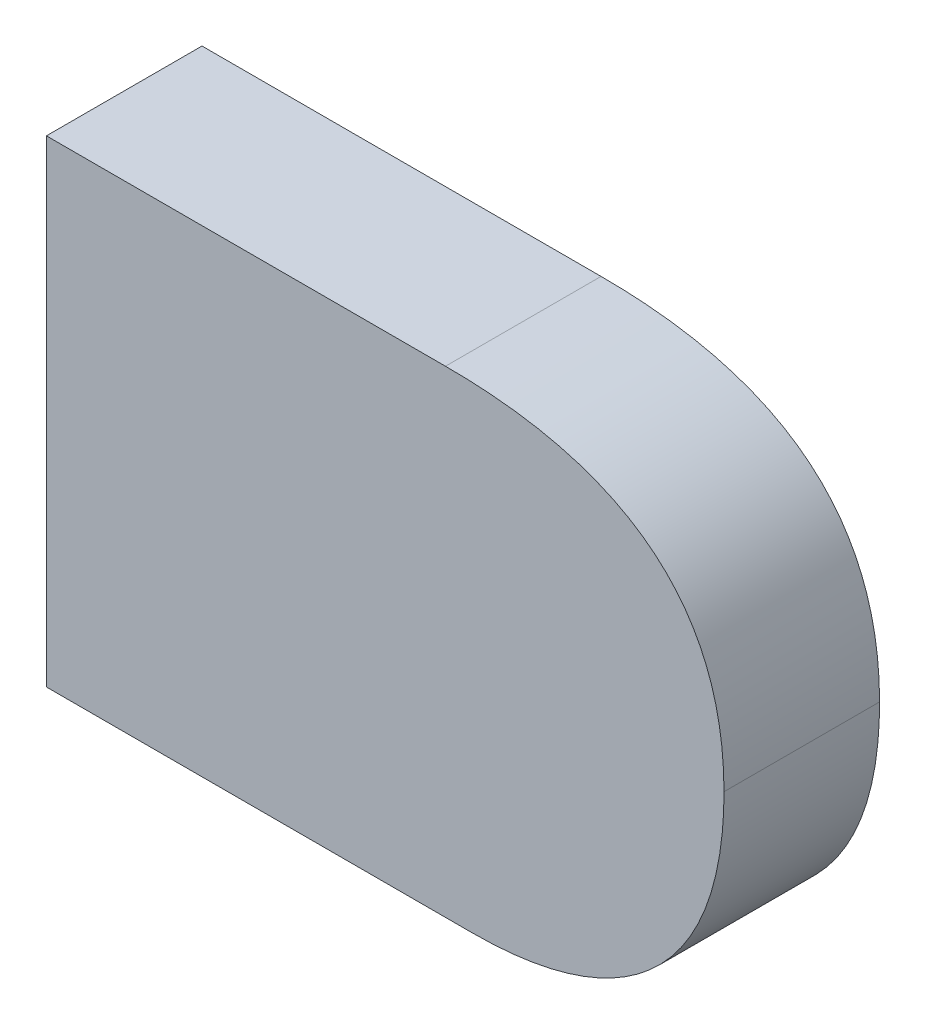
ISO-10303-21;
HEADER;
FILE_DESCRIPTION(('STEP AP214'),'2;1');
FILE_NAME('part.step','',(''),(''),'','','');
FILE_SCHEMA(('AUTOMOTIVE_DESIGN { 1 0 10303 214 1 1 1 1 }'));
ENDSEC;
DATA;
#1=APPLICATION_CONTEXT('core data for automotive mechanical design processes');
#2=APPLICATION_PROTOCOL_DEFINITION('international standard','automotive_design',2000,#1);
#3=PRODUCT_CONTEXT('',#1,'mechanical');
#4=PRODUCT('Part','Part','',(#3));
#5=PRODUCT_RELATED_PRODUCT_CATEGORY('part','',(#4));
#6=PRODUCT_DEFINITION_FORMATION('','',#4);
#7=PRODUCT_DEFINITION_CONTEXT('part definition',#1,'design');
#8=PRODUCT_DEFINITION('design','',#6,#7);
#9=PRODUCT_DEFINITION_SHAPE('','',#8);
#10=(LENGTH_UNIT() NAMED_UNIT(*) SI_UNIT(.MILLI.,.METRE.));
#11=(NAMED_UNIT(*) PLANE_ANGLE_UNIT() SI_UNIT($,.RADIAN.));
#12=(NAMED_UNIT(*) SI_UNIT($,.STERADIAN.) SOLID_ANGLE_UNIT());
#13=UNCERTAINTY_MEASURE_WITH_UNIT(LENGTH_MEASURE(1.E-05),#10,'distance_accuracy_value','');
#14=(GEOMETRIC_REPRESENTATION_CONTEXT(3) GLOBAL_UNCERTAINTY_ASSIGNED_CONTEXT((#13)) GLOBAL_UNIT_ASSIGNED_CONTEXT((#10,
#11,#12)) REPRESENTATION_CONTEXT('',''));
#15=CARTESIAN_POINT('',(0.,0.,0.));
#16=DIRECTION('',(0.,0.,1.));
#17=DIRECTION('',(1.,0.,0.));
#18=AXIS2_PLACEMENT_3D('',#15,#16,#17);
#19=CARTESIAN_POINT('',(-20.10013293961,-4.726721493966,19.2));
#20=DIRECTION('',(0.,0.,1.));
#21=DIRECTION('',(1.,0.,0.));
#22=AXIS2_PLACEMENT_3D('',#19,#20,#21);
#23=PLANE('',#22);
#24=DIRECTION('',(0.,-1.,0.));
#25=VECTOR('',#24,1.);
#26=CARTESIAN_POINT('',(-22.18731541969,-3.204380728079,19.2));
#27=LINE('',#26,#25);
#28=CARTESIAN_POINT('',(-22.18731541969,-3.204380728079,19.2));
#29=VERTEX_POINT('',#28);
#30=CARTESIAN_POINT('',(-22.18731541969,-6.272551150301,19.2));
#31=VERTEX_POINT('',#30);
#32=EDGE_CURVE('E116',#29,#31,#27,.T.);
#33=ORIENTED_EDGE('',*,*,#32,.F.);
#34=DIRECTION('',(-1.,0.,0.));
#35=VECTOR('',#34,1.);
#36=CARTESIAN_POINT('',(-19.62225408636,-3.204380728079,19.2));
#37=LINE('',#36,#35);
#38=CARTESIAN_POINT('',(-19.62225408636,-3.204380728079,19.2));
#39=VERTEX_POINT('',#38);
#40=EDGE_CURVE('E29',#39,#29,#37,.T.);
#41=ORIENTED_EDGE('',*,*,#40,.F.);
#42=CARTESIAN_POINT('',(-80.5059650487069,-54.8977948189727,19.2));
#43=DIRECTION('',(0.,0.,1.));
#44=DIRECTION('',(0.773188722135839,0.634176000777346,0.));
#45=AXIS2_PLACEMENT_3D('',#42,#43,#44);
#46=ELLIPSE('',#45,80.6819875903435,9.52083510666188);
#47=CARTESIAN_POINT('',(-17.83204515303,-4.677730305857,19.2));
#48=VERTEX_POINT('',#47);
#49=EDGE_CURVE('E80',#48,#39,#46,.T.);
#50=ORIENTED_EDGE('',*,*,#49,.F.);
#51=CARTESIAN_POINT('',(-19.45169308636,-6.272551150301,19.2));
#52=CARTESIAN_POINT('',(-18.37575190858,-6.272551150301,19.2));
#53=CARTESIAN_POINT('',(-17.83204515303,-5.651992461412,19.2));
#54=CARTESIAN_POINT('',(-17.83204515303,-4.677730305857,19.2));
#55=(BOUNDED_CURVE() B_SPLINE_CURVE(3,(#51,#52,#53,#54),.UNSPECIFIED.,.F.,
.F.) B_SPLINE_CURVE_WITH_KNOTS((4,4),(0.,1.),
.UNSPECIFIED.) CURVE() GEOMETRIC_REPRESENTATION_ITEM() RATIONAL_B_SPLINE_CURVE((1.,1.,1.,1.)) REPRESENTATION_ITEM(''));
#56=CARTESIAN_POINT('',(-19.45169308636,-6.272551150301,19.2));
#57=VERTEX_POINT('',#56);
#58=EDGE_CURVE('E107',#57,#48,#55,.T.);
#59=ORIENTED_EDGE('',*,*,#58,.F.);
#60=DIRECTION('',(1.,0.,0.));
#61=VECTOR('',#60,1.);
#62=CARTESIAN_POINT('',(-22.18731541969,-6.272551150301,19.2));
#63=LINE('',#62,#61);
#64=EDGE_CURVE('E22',#31,#57,#63,.T.);
#65=ORIENTED_EDGE('',*,*,#64,.F.);
#66=EDGE_LOOP('',(#33,#41,#50,#59,#65));
#67=FACE_BOUND('',#66,.T.);
#68=ADVANCED_FACE('F16',(#67),#23,.F.);
#69=CARTESIAN_POINT('',(-20.10013293961,-4.726721493966,20.2));
#70=DIRECTION('',(0.,0.,1.));
#71=DIRECTION('',(1.,0.,0.));
#72=AXIS2_PLACEMENT_3D('',#69,#70,#71);
#73=PLANE('',#72);
#74=DIRECTION('',(0.,-1.,0.));
#75=VECTOR('',#74,1.);
#76=CARTESIAN_POINT('',(-22.18731541969,-3.204380728079,20.2));
#77=LINE('',#76,#75);
#78=CARTESIAN_POINT('',(-22.18731541969,-3.204380728079,20.2));
#79=VERTEX_POINT('',#78);
#80=CARTESIAN_POINT('',(-22.18731541969,-6.272551150301,20.2));
#81=VERTEX_POINT('',#80);
#82=EDGE_CURVE('E102',#79,#81,#77,.T.);
#83=ORIENTED_EDGE('',*,*,#82,.T.);
#84=DIRECTION('',(1.,0.,0.));
#85=VECTOR('',#84,1.);
#86=CARTESIAN_POINT('',(-22.18731541969,-6.272551150301,20.2));
#87=LINE('',#86,#85);
#88=CARTESIAN_POINT('',(-19.45169308636,-6.272551150301,20.2));
#89=VERTEX_POINT('',#88);
#90=EDGE_CURVE('E99',#81,#89,#87,.T.);
#91=ORIENTED_EDGE('',*,*,#90,.T.);
#92=CARTESIAN_POINT('',(-19.45169308636,-6.272551150301,20.2));
#93=CARTESIAN_POINT('',(-18.37575190858,-6.272551150301,20.2));
#94=CARTESIAN_POINT('',(-17.83204515303,-5.651992461412,20.2));
#95=CARTESIAN_POINT('',(-17.83204515303,-4.677730305857,20.2));
#96=(BOUNDED_CURVE() B_SPLINE_CURVE(3,(#92,#93,#94,#95),.UNSPECIFIED.,.F.,
.F.) B_SPLINE_CURVE_WITH_KNOTS((4,4),(0.,1.),
.UNSPECIFIED.) CURVE() GEOMETRIC_REPRESENTATION_ITEM() RATIONAL_B_SPLINE_CURVE((1.,1.,1.,1.)) REPRESENTATION_ITEM(''));
#97=CARTESIAN_POINT('',(-17.83204515303,-4.677730305857,20.2));
#98=VERTEX_POINT('',#97);
#99=EDGE_CURVE('E87',#89,#98,#96,.T.);
#100=ORIENTED_EDGE('',*,*,#99,.T.);
#101=CARTESIAN_POINT('',(-80.5059650489193,-54.8977948191492,20.2));
#102=DIRECTION('',(0.,0.,1.));
#103=DIRECTION('',(0.773188722135825,0.634176000777363,0.));
#104=AXIS2_PLACEMENT_3D('',#101,#102,#103);
#105=ELLIPSE('',#104,80.6819875906196,9.52083510667817);
#106=CARTESIAN_POINT('',(-19.62225408636,-3.204380728079,20.2));
#107=VERTEX_POINT('',#106);
#108=EDGE_CURVE('E72',#98,#107,#105,.T.);
#109=ORIENTED_EDGE('',*,*,#108,.T.);
#110=DIRECTION('',(-1.,0.,0.));
#111=VECTOR('',#110,1.);
#112=CARTESIAN_POINT('',(-19.62225408636,-3.204380728079,20.2));
#113=LINE('',#112,#111);
#114=EDGE_CURVE('E11',#107,#79,#113,.T.);
#115=ORIENTED_EDGE('',*,*,#114,.T.);
#116=EDGE_LOOP('',(#83,#91,#100,#109,#115));
#117=FACE_BOUND('',#116,.T.);
#118=ADVANCED_FACE('F100',(#117),#73,.T.);
#119=CARTESIAN_POINT('',(-20.904784753025,-3.204380728079,19.19));
#120=DIRECTION('',(0.,1.,0.));
#121=DIRECTION('',(1.,0.,0.));
#122=AXIS2_PLACEMENT_3D('',#119,#120,#121);
#123=PLANE('',#122);
#124=DIRECTION('',(0.,0.,-1.));
#125=VECTOR('',#124,1.);
#126=CARTESIAN_POINT('',(-19.62225408636,-3.204380728079,20.2));
#127=LINE('',#126,#125);
#128=EDGE_CURVE('E125',#107,#39,#127,.T.);
#129=ORIENTED_EDGE('',*,*,#128,.T.);
#130=ORIENTED_EDGE('',*,*,#40,.T.);
#131=DIRECTION('',(0.,0.,-1.));
#132=VECTOR('',#131,1.);
#133=CARTESIAN_POINT('',(-22.18731541969,-3.204380728079,20.2));
#134=LINE('',#133,#132);
#135=EDGE_CURVE('E138',#79,#29,#134,.T.);
#136=ORIENTED_EDGE('',*,*,#135,.F.);
#137=ORIENTED_EDGE('',*,*,#114,.F.);
#138=EDGE_LOOP('',(#129,#130,#136,#137));
#139=FACE_BOUND('',#138,.T.);
#140=ADVANCED_FACE('F159',(#139),#123,.T.);
#141=CARTESIAN_POINT('',(-17.8320450861451,-4.67873048769058,20.2));
#142=CARTESIAN_POINT('',(-17.8319611589225,-4.08673515703857,20.2));
#143=CARTESIAN_POINT('',(-18.1235621643496,-3.73121459416125,20.2));
#144=CARTESIAN_POINT('',(-18.5565124089145,-3.2033607398161,20.2));
#145=CARTESIAN_POINT('',(-19.6232542349093,-3.20438156845886,20.2));
#146=CARTESIAN_POINT('',(-17.8320450861451,-4.67873048769058,19.2));
#147=CARTESIAN_POINT('',(-17.8319611589225,-4.08673515703857,19.2));
#148=CARTESIAN_POINT('',(-18.1235621643496,-3.73121459416125,19.2));
#149=CARTESIAN_POINT('',(-18.5565124089145,-3.2033607398161,19.2));
#150=CARTESIAN_POINT('',(-19.6232542349093,-3.20438156845886,19.2));
#151=(BOUNDED_SURFACE() B_SPLINE_SURFACE(1,2,((#141,#142,#143,#144,#145),(#146,#147,#148,#149,
#150)),.UNSPECIFIED.,.F.,.F.,.F.) B_SPLINE_SURFACE_WITH_KNOTS((2,2),(3,2,3),
(-0.0124067345126912,-1.23943401725175E-05),(244.98373425899,253.469939493471,265.951051695831),
.UNSPECIFIED.) GEOMETRIC_REPRESENTATION_ITEM() RATIONAL_B_SPLINE_SURFACE(((0.963402069836604,
0.980387796899263,1.,0.971155292539806,0.947991953544438),(0.963402069836604,0.980387796899263,
1.,0.971155292539806,0.947991953544438))) REPRESENTATION_ITEM('') SURFACE());
#152=DIRECTION('',(0.,0.,-1.));
#153=VECTOR('',#152,1.);
#154=CARTESIAN_POINT('',(-17.83204515303,-4.677730305857,20.2));
#155=LINE('',#154,#153);
#156=EDGE_CURVE('E94',#98,#48,#155,.T.);
#157=ORIENTED_EDGE('',*,*,#156,.T.);
#158=ORIENTED_EDGE('',*,*,#49,.T.);
#159=ORIENTED_EDGE('',*,*,#128,.F.);
#160=ORIENTED_EDGE('',*,*,#108,.F.);
#161=EDGE_LOOP('',(#157,#158,#159,#160));
#162=FACE_BOUND('',#161,.T.);
#163=ADVANCED_FACE('F18',(#162),#151,.T.);
#164=CARTESIAN_POINT('',(-19.45169308636,-6.272551150301,19.199));
#165=CARTESIAN_POINT('',(-19.45169308636,-6.272551150301,20.201));
#166=CARTESIAN_POINT('',(-18.37575190858,-6.272551150301,19.199));
#167=CARTESIAN_POINT('',(-18.37575190858,-6.272551150301,20.201));
#168=CARTESIAN_POINT('',(-17.83204515303,-5.651992461412,19.199));
#169=CARTESIAN_POINT('',(-17.83204515303,-5.651992461412,20.201));
#170=CARTESIAN_POINT('',(-17.83204515303,-4.677730305857,19.199));
#171=CARTESIAN_POINT('',(-17.83204515303,-4.677730305857,20.201));
#172=(BOUNDED_SURFACE() B_SPLINE_SURFACE(3,1,((#164,#165),(#166,#167),(#168,#169),(#170,#171)),
.UNSPECIFIED.,.F.,.F.,.F.) B_SPLINE_SURFACE_WITH_KNOTS((4,4),(2,2),(0.,1.),(-1.001,0.001),
.UNSPECIFIED.) GEOMETRIC_REPRESENTATION_ITEM() RATIONAL_B_SPLINE_SURFACE(((1.,1.),(1.,1.),(1.,
1.),(1.,1.))) REPRESENTATION_ITEM('') SURFACE());
#173=DIRECTION('',(0.,0.,-1.));
#174=VECTOR('',#173,1.);
#175=CARTESIAN_POINT('',(-19.45169308636,-6.272551150301,20.2));
#176=LINE('',#175,#174);
#177=EDGE_CURVE('E92',#89,#57,#176,.T.);
#178=ORIENTED_EDGE('',*,*,#177,.T.);
#179=ORIENTED_EDGE('',*,*,#58,.T.);
#180=ORIENTED_EDGE('',*,*,#156,.F.);
#181=ORIENTED_EDGE('',*,*,#99,.F.);
#182=EDGE_LOOP('',(#178,#179,#180,#181));
#183=FACE_BOUND('',#182,.T.);
#184=ADVANCED_FACE('F89',(#183),#172,.T.);
#185=CARTESIAN_POINT('',(-20.819504253025,-6.272551150301,19.19));
#186=DIRECTION('',(0.,-1.,0.));
#187=DIRECTION('',(0.,0.,-1.));
#188=AXIS2_PLACEMENT_3D('',#185,#186,#187);
#189=PLANE('',#188);
#190=DIRECTION('',(0.,0.,-1.));
#191=VECTOR('',#190,1.);
#192=CARTESIAN_POINT('',(-22.18731541969,-6.272551150301,20.2));
#193=LINE('',#192,#191);
#194=EDGE_CURVE('E140',#81,#31,#193,.T.);
#195=ORIENTED_EDGE('',*,*,#194,.T.);
#196=ORIENTED_EDGE('',*,*,#64,.T.);
#197=ORIENTED_EDGE('',*,*,#177,.F.);
#198=ORIENTED_EDGE('',*,*,#90,.F.);
#199=EDGE_LOOP('',(#195,#196,#197,#198));
#200=FACE_BOUND('',#199,.T.);
#201=ADVANCED_FACE('F109',(#200),#189,.T.);
#202=CARTESIAN_POINT('',(-22.18731541969,-4.73846593919,19.19));
#203=DIRECTION('',(-1.,0.,0.));
#204=DIRECTION('',(0.,0.,1.));
#205=AXIS2_PLACEMENT_3D('',#202,#203,#204);
#206=PLANE('',#205);
#207=ORIENTED_EDGE('',*,*,#135,.T.);
#208=ORIENTED_EDGE('',*,*,#32,.T.);
#209=ORIENTED_EDGE('',*,*,#194,.F.);
#210=ORIENTED_EDGE('',*,*,#82,.F.);
#211=EDGE_LOOP('',(#207,#208,#209,#210));
#212=FACE_BOUND('',#211,.T.);
#213=ADVANCED_FACE('F149',(#212),#206,.T.);
#214=CLOSED_SHELL('',(#68,#118,#140,#163,#184,#201,#213));
#215=MANIFOLD_SOLID_BREP('B1',#214);
#216=ADVANCED_BREP_SHAPE_REPRESENTATION('',(#18,#215),#14);
#217=SHAPE_DEFINITION_REPRESENTATION(#9,#216);
ENDSEC;
END-ISO-10303-21;
